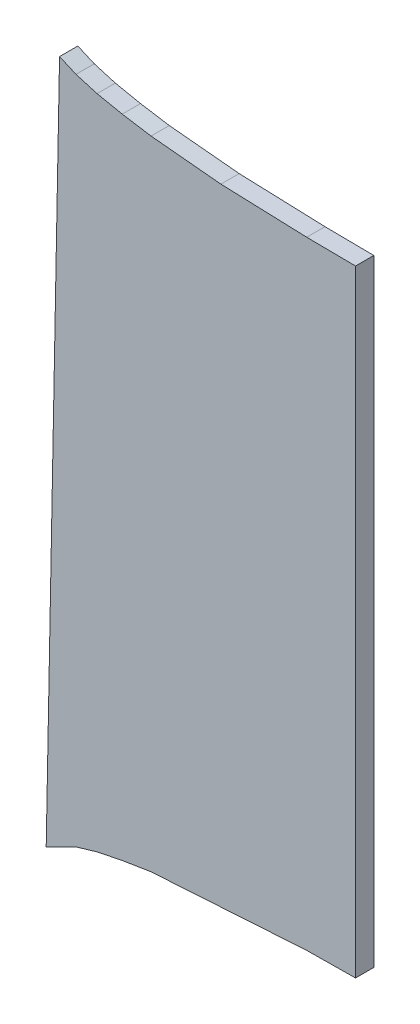
ISO-10303-21;
HEADER;
FILE_DESCRIPTION(('STEP AP214'),'2;1');
FILE_NAME('part.step','',(''),(''),'','','');
FILE_SCHEMA(('AUTOMOTIVE_DESIGN { 1 0 10303 214 1 1 1 1 }'));
ENDSEC;
DATA;
#1=APPLICATION_CONTEXT('core data for automotive mechanical design processes');
#2=APPLICATION_PROTOCOL_DEFINITION('international standard','automotive_design',2000,#1);
#3=PRODUCT_CONTEXT('',#1,'mechanical');
#4=PRODUCT('Part','Part','',(#3));
#5=PRODUCT_RELATED_PRODUCT_CATEGORY('part','',(#4));
#6=PRODUCT_DEFINITION_FORMATION('','',#4);
#7=PRODUCT_DEFINITION_CONTEXT('part definition',#1,'design');
#8=PRODUCT_DEFINITION('design','',#6,#7);
#9=PRODUCT_DEFINITION_SHAPE('','',#8);
#10=(LENGTH_UNIT() NAMED_UNIT(*) SI_UNIT(.MILLI.,.METRE.));
#11=(NAMED_UNIT(*) PLANE_ANGLE_UNIT() SI_UNIT($,.RADIAN.));
#12=(NAMED_UNIT(*) SI_UNIT($,.STERADIAN.) SOLID_ANGLE_UNIT());
#13=UNCERTAINTY_MEASURE_WITH_UNIT(LENGTH_MEASURE(1.E-05),#10,'distance_accuracy_value','');
#14=(GEOMETRIC_REPRESENTATION_CONTEXT(3) GLOBAL_UNCERTAINTY_ASSIGNED_CONTEXT((#13)) GLOBAL_UNIT_ASSIGNED_CONTEXT((#10,
#11,#12)) REPRESENTATION_CONTEXT('',''));
#15=CARTESIAN_POINT('',(0.,0.,0.));
#16=DIRECTION('',(0.,0.,1.));
#17=DIRECTION('',(1.,0.,0.));
#18=AXIS2_PLACEMENT_3D('',#15,#16,#17);
#19=CARTESIAN_POINT('',(36.9690017700195,71.5999984741211,0.));
#20=DIRECTION('',(-0.010519816185477,-0.999944665202742,0.));
#21=DIRECTION('',(-0.999944665202742,0.010519816185477,0.));
#22=AXIS2_PLACEMENT_3D('',#19,#20,#21);
#23=PLANE('',#22);
#24=DIRECTION('',(-0.999944665202742,0.010519816185477,0.));
#25=VECTOR('',#24,1.);
#26=CARTESIAN_POINT('',(36.9690017700195,71.5999984741211,0.03556));
#27=LINE('',#26,#25);
#28=CARTESIAN_POINT('',(36.9690017700195,71.5999984741211,0.03556));
#29=VERTEX_POINT('',#28);
#30=CARTESIAN_POINT('',(36.8740005493164,71.6009979248047,0.03556));
#31=VERTEX_POINT('',#30);
#32=EDGE_CURVE('E11',#29,#31,#27,.T.);
#33=ORIENTED_EDGE('',*,*,#32,.F.);
#34=DIRECTION('',(0.,0.,1.));
#35=VECTOR('',#34,1.);
#36=CARTESIAN_POINT('',(36.9690017700195,71.5999984741211,0.));
#37=LINE('',#36,#35);
#38=CARTESIAN_POINT('',(36.9690017700195,71.5999984741211,0.));
#39=VERTEX_POINT('',#38);
#40=EDGE_CURVE('E24',#39,#29,#37,.T.);
#41=ORIENTED_EDGE('',*,*,#40,.F.);
#42=DIRECTION('',(-0.999944665202742,0.010519816185477,0.));
#43=VECTOR('',#42,1.);
#44=CARTESIAN_POINT('',(36.9690017700195,71.5999984741211,0.));
#45=LINE('',#44,#43);
#46=CARTESIAN_POINT('',(36.8740005493164,71.6009979248047,0.));
#47=VERTEX_POINT('',#46);
#48=EDGE_CURVE('E142',#39,#47,#45,.T.);
#49=ORIENTED_EDGE('',*,*,#48,.T.);
#50=DIRECTION('',(0.,0.,1.));
#51=VECTOR('',#50,1.);
#52=CARTESIAN_POINT('',(36.8740005493164,71.6009979248047,0.));
#53=LINE('',#52,#51);
#54=EDGE_CURVE('E37',#47,#31,#53,.T.);
#55=ORIENTED_EDGE('',*,*,#54,.T.);
#56=EDGE_LOOP('',(#33,#41,#49,#55));
#57=FACE_BOUND('',#56,.T.);
#58=ADVANCED_FACE('F17',(#57),#23,.F.);
#59=CARTESIAN_POINT('',(36.8740005493164,71.6009979248047,0.));
#60=DIRECTION('',(-0.0359309157724351,-0.999354276166242,0.));
#61=DIRECTION('',(-0.999354276166242,0.0359309157724351,0.));
#62=AXIS2_PLACEMENT_3D('',#59,#60,#61);
#63=PLANE('',#62);
#64=DIRECTION('',(-0.999354276166242,0.0359309157724351,0.));
#65=VECTOR('',#64,1.);
#66=CARTESIAN_POINT('',(36.8740005493164,71.6009979248047,0.03556));
#67=LINE('',#66,#65);
#68=CARTESIAN_POINT('',(36.7070007324219,71.6070022583008,0.03556));
#69=VERTEX_POINT('',#68);
#70=EDGE_CURVE('E238',#31,#69,#67,.T.);
#71=ORIENTED_EDGE('',*,*,#70,.F.);
#72=ORIENTED_EDGE('',*,*,#54,.F.);
#73=DIRECTION('',(-0.999354276166242,0.0359309157724351,0.));
#74=VECTOR('',#73,1.);
#75=CARTESIAN_POINT('',(36.8740005493164,71.6009979248047,0.));
#76=LINE('',#75,#74);
#77=CARTESIAN_POINT('',(36.7070007324219,71.6070022583008,0.));
#78=VERTEX_POINT('',#77);
#79=EDGE_CURVE('E235',#47,#78,#76,.T.);
#80=ORIENTED_EDGE('',*,*,#79,.T.);
#81=DIRECTION('',(0.,0.,1.));
#82=VECTOR('',#81,1.);
#83=CARTESIAN_POINT('',(36.7070007324219,71.6070022583008,0.));
#84=LINE('',#83,#82);
#85=EDGE_CURVE('E233',#78,#69,#84,.T.);
#86=ORIENTED_EDGE('',*,*,#85,.T.);
#87=EDGE_LOOP('',(#71,#72,#80,#86));
#88=FACE_BOUND('',#87,.T.);
#89=ADVANCED_FACE('F246',(#88),#63,.F.);
#90=CARTESIAN_POINT('',(36.7070007324219,71.6070022583008,0.));
#91=DIRECTION('',(-0.0951569465430121,-0.99546228232144,0.));
#92=DIRECTION('',(-0.99546228232144,0.0951569465430121,0.));
#93=AXIS2_PLACEMENT_3D('',#90,#91,#92);
#94=PLANE('',#93);
#95=DIRECTION('',(-0.99546228232144,0.0951569465430121,0.));
#96=VECTOR('',#95,1.);
#97=CARTESIAN_POINT('',(36.7070007324219,71.6070022583008,0.03556));
#98=LINE('',#97,#96);
#99=CARTESIAN_POINT('',(36.5709991455078,71.620002746582,0.03556));
#100=VERTEX_POINT('',#99);
#101=EDGE_CURVE('E230',#69,#100,#98,.T.);
#102=ORIENTED_EDGE('',*,*,#101,.F.);
#103=ORIENTED_EDGE('',*,*,#85,.F.);
#104=DIRECTION('',(-0.99546228232144,0.0951569465430121,0.));
#105=VECTOR('',#104,1.);
#106=CARTESIAN_POINT('',(36.7070007324219,71.6070022583008,0.));
#107=LINE('',#106,#105);
#108=CARTESIAN_POINT('',(36.5709991455078,71.620002746582,0.));
#109=VERTEX_POINT('',#108);
#110=EDGE_CURVE('E227',#78,#109,#107,.T.);
#111=ORIENTED_EDGE('',*,*,#110,.T.);
#112=DIRECTION('',(0.,0.,1.));
#113=VECTOR('',#112,1.);
#114=CARTESIAN_POINT('',(36.5709991455078,71.620002746582,0.));
#115=LINE('',#114,#113);
#116=EDGE_CURVE('E225',#109,#100,#115,.T.);
#117=ORIENTED_EDGE('',*,*,#116,.T.);
#118=EDGE_LOOP('',(#102,#103,#111,#117));
#119=FACE_BOUND('',#118,.T.);
#120=ADVANCED_FACE('F252',(#119),#94,.F.);
#121=CARTESIAN_POINT('',(36.5709991455078,71.620002746582,0.));
#122=DIRECTION('',(-0.158593797855478,-0.987343915402215,0.));
#123=DIRECTION('',(-0.987343915402215,0.158593797855478,0.));
#124=AXIS2_PLACEMENT_3D('',#121,#122,#123);
#125=PLANE('',#124);
#126=DIRECTION('',(-0.987343915402215,0.158593797855478,0.));
#127=VECTOR('',#126,1.);
#128=CARTESIAN_POINT('',(36.5709991455078,71.620002746582,0.03556));
#129=LINE('',#128,#127);
#130=CARTESIAN_POINT('',(36.5149993896484,71.6289978027344,0.03556));
#131=VERTEX_POINT('',#130);
#132=EDGE_CURVE('E222',#100,#131,#129,.T.);
#133=ORIENTED_EDGE('',*,*,#132,.F.);
#134=ORIENTED_EDGE('',*,*,#116,.F.);
#135=DIRECTION('',(-0.987343915402215,0.158593797855478,0.));
#136=VECTOR('',#135,1.);
#137=CARTESIAN_POINT('',(36.5709991455078,71.620002746582,0.));
#138=LINE('',#137,#136);
#139=CARTESIAN_POINT('',(36.5149993896484,71.6289978027344,0.));
#140=VERTEX_POINT('',#139);
#141=EDGE_CURVE('E219',#109,#140,#138,.T.);
#142=ORIENTED_EDGE('',*,*,#141,.T.);
#143=DIRECTION('',(0.,0.,1.));
#144=VECTOR('',#143,1.);
#145=CARTESIAN_POINT('',(36.5149993896484,71.6289978027344,0.));
#146=LINE('',#145,#144);
#147=EDGE_CURVE('E217',#140,#131,#146,.T.);
#148=ORIENTED_EDGE('',*,*,#147,.T.);
#149=EDGE_LOOP('',(#133,#134,#142,#148));
#150=FACE_BOUND('',#149,.T.);
#151=ADVANCED_FACE('F254',(#150),#125,.F.);
#152=CARTESIAN_POINT('',(36.5149993896484,71.6289978027344,0.));
#153=DIRECTION('',(-0.200001856638997,-0.979795518126591,0.));
#154=DIRECTION('',(-0.979795518126591,0.200001856638997,0.));
#155=AXIS2_PLACEMENT_3D('',#152,#153,#154);
#156=PLANE('',#155);
#157=DIRECTION('',(-0.979795518126591,0.200001856638997,0.));
#158=VECTOR('',#157,1.);
#159=CARTESIAN_POINT('',(36.5149993896484,71.6289978027344,0.03556));
#160=LINE('',#159,#158);
#161=CARTESIAN_POINT('',(36.4659996032715,71.6389999389648,0.03556));
#162=VERTEX_POINT('',#161);
#163=EDGE_CURVE('E214',#131,#162,#160,.T.);
#164=ORIENTED_EDGE('',*,*,#163,.F.);
#165=ORIENTED_EDGE('',*,*,#147,.F.);
#166=DIRECTION('',(-0.979795518126591,0.200001856638997,0.));
#167=VECTOR('',#166,1.);
#168=CARTESIAN_POINT('',(36.5149993896484,71.6289978027344,0.));
#169=LINE('',#168,#167);
#170=CARTESIAN_POINT('',(36.4659996032715,71.6389999389648,0.));
#171=VERTEX_POINT('',#170);
#172=EDGE_CURVE('E211',#140,#171,#169,.T.);
#173=ORIENTED_EDGE('',*,*,#172,.T.);
#174=DIRECTION('',(0.,0.,1.));
#175=VECTOR('',#174,1.);
#176=CARTESIAN_POINT('',(36.4659996032715,71.6389999389648,0.));
#177=LINE('',#176,#175);
#178=EDGE_CURVE('E209',#171,#162,#177,.T.);
#179=ORIENTED_EDGE('',*,*,#178,.T.);
#180=EDGE_LOOP('',(#164,#165,#173,#179));
#181=FACE_BOUND('',#180,.T.);
#182=ADVANCED_FACE('F259',(#181),#156,.F.);
#183=CARTESIAN_POINT('',(36.4659996032715,71.6389999389648,0.));
#184=DIRECTION('',(-0.280918813771343,-0.959731535414619,0.));
#185=DIRECTION('',(-0.959731535414619,0.280918813771343,0.));
#186=AXIS2_PLACEMENT_3D('',#183,#184,#185);
#187=PLANE('',#186);
#188=DIRECTION('',(-0.959731535414619,0.280918813771343,0.));
#189=VECTOR('',#188,1.);
#190=CARTESIAN_POINT('',(36.4659996032715,71.6389999389648,0.03556));
#191=LINE('',#190,#189);
#192=CARTESIAN_POINT('',(36.4249992370605,71.6510009765625,0.03556));
#193=VERTEX_POINT('',#192);
#194=EDGE_CURVE('E206',#162,#193,#191,.T.);
#195=ORIENTED_EDGE('',*,*,#194,.F.);
#196=ORIENTED_EDGE('',*,*,#178,.F.);
#197=DIRECTION('',(-0.959731535414619,0.280918813771343,0.));
#198=VECTOR('',#197,1.);
#199=CARTESIAN_POINT('',(36.4659996032715,71.6389999389648,0.));
#200=LINE('',#199,#198);
#201=CARTESIAN_POINT('',(36.4249992370605,71.6510009765625,0.));
#202=VERTEX_POINT('',#201);
#203=EDGE_CURVE('E203',#171,#202,#200,.T.);
#204=ORIENTED_EDGE('',*,*,#203,.T.);
#205=DIRECTION('',(0.,0.,1.));
#206=VECTOR('',#205,1.);
#207=CARTESIAN_POINT('',(36.4249992370605,71.6510009765625,0.));
#208=LINE('',#207,#206);
#209=EDGE_CURVE('E201',#202,#193,#208,.T.);
#210=ORIENTED_EDGE('',*,*,#209,.T.);
#211=EDGE_LOOP('',(#195,#196,#204,#210));
#212=FACE_BOUND('',#211,.T.);
#213=ADVANCED_FACE('F262',(#212),#187,.F.);
#214=CARTESIAN_POINT('',(36.4249992370605,71.6510009765625,0.));
#215=DIRECTION('',(-0.400841752438229,-0.916147307752552,0.));
#216=DIRECTION('',(-0.916147307752552,0.400841752438229,0.));
#217=AXIS2_PLACEMENT_3D('',#214,#215,#216);
#218=PLANE('',#217);
#219=DIRECTION('',(-0.916147307752552,0.400841752438229,0.));
#220=VECTOR('',#219,1.);
#221=CARTESIAN_POINT('',(36.4249992370605,71.6510009765625,0.03556));
#222=LINE('',#221,#220);
#223=CARTESIAN_POINT('',(36.3930015563965,71.6650009155273,0.03556));
#224=VERTEX_POINT('',#223);
#225=EDGE_CURVE('E198',#193,#224,#222,.T.);
#226=ORIENTED_EDGE('',*,*,#225,.F.);
#227=ORIENTED_EDGE('',*,*,#209,.F.);
#228=DIRECTION('',(-0.916147307752552,0.400841752438229,0.));
#229=VECTOR('',#228,1.);
#230=CARTESIAN_POINT('',(36.4249992370605,71.6510009765625,0.));
#231=LINE('',#230,#229);
#232=CARTESIAN_POINT('',(36.3930015563965,71.6650009155273,0.));
#233=VERTEX_POINT('',#232);
#234=EDGE_CURVE('E195',#202,#233,#231,.T.);
#235=ORIENTED_EDGE('',*,*,#234,.T.);
#236=DIRECTION('',(0.,0.,1.));
#237=VECTOR('',#236,1.);
#238=CARTESIAN_POINT('',(36.3930015563965,71.6650009155273,0.));
#239=LINE('',#238,#237);
#240=EDGE_CURVE('E193',#233,#224,#239,.T.);
#241=ORIENTED_EDGE('',*,*,#240,.T.);
#242=EDGE_LOOP('',(#226,#227,#235,#241));
#243=FACE_BOUND('',#242,.T.);
#244=ADVANCED_FACE('F267',(#243),#218,.F.);
#245=CARTESIAN_POINT('',(36.3930015563965,71.6650009155273,0.));
#246=DIRECTION('',(0.999813197681205,-0.0193279523614092,0.));
#247=DIRECTION('',(-0.0193279523614092,-0.999813197681205,0.));
#248=AXIS2_PLACEMENT_3D('',#245,#246,#247);
#249=PLANE('',#248);
#250=DIRECTION('',(-0.0193279523614092,-0.999813197681205,0.));
#251=VECTOR('',#250,1.);
#252=CARTESIAN_POINT('',(36.3930015563965,71.6650009155273,0.03556));
#253=LINE('',#252,#251);
#254=CARTESIAN_POINT('',(36.367000579834,70.3199996948242,0.03556));
#255=VERTEX_POINT('',#254);
#256=EDGE_CURVE('E190',#224,#255,#253,.T.);
#257=ORIENTED_EDGE('',*,*,#256,.F.);
#258=ORIENTED_EDGE('',*,*,#240,.F.);
#259=DIRECTION('',(-0.0193279523614092,-0.999813197681205,0.));
#260=VECTOR('',#259,1.);
#261=CARTESIAN_POINT('',(36.3930015563965,71.6650009155273,0.));
#262=LINE('',#261,#260);
#263=CARTESIAN_POINT('',(36.367000579834,70.3199996948242,0.));
#264=VERTEX_POINT('',#263);
#265=EDGE_CURVE('E187',#233,#264,#262,.T.);
#266=ORIENTED_EDGE('',*,*,#265,.T.);
#267=DIRECTION('',(0.,0.,1.));
#268=VECTOR('',#267,1.);
#269=CARTESIAN_POINT('',(36.367000579834,70.3199996948242,0.));
#270=LINE('',#269,#268);
#271=EDGE_CURVE('E185',#264,#255,#270,.T.);
#272=ORIENTED_EDGE('',*,*,#271,.T.);
#273=EDGE_LOOP('',(#257,#258,#266,#272));
#274=FACE_BOUND('',#273,.T.);
#275=ADVANCED_FACE('F270',(#274),#249,.F.);
#276=CARTESIAN_POINT('',(36.367000579834,70.3199996948242,0.));
#277=DIRECTION('',(-0.447213595499958,0.894427190999916,0.));
#278=DIRECTION('',(0.894427190999916,0.447213595499958,0.));
#279=AXIS2_PLACEMENT_3D('',#276,#277,#278);
#280=PLANE('',#279);
#281=DIRECTION('',(0.894427190999916,0.447213595499958,0.));
#282=VECTOR('',#281,1.);
#283=CARTESIAN_POINT('',(36.367000579834,70.3199996948242,0.03556));
#284=LINE('',#283,#282);
#285=CARTESIAN_POINT('',(36.4249992370605,70.3489990234375,0.03556));
#286=VERTEX_POINT('',#285);
#287=EDGE_CURVE('E182',#255,#286,#284,.T.);
#288=ORIENTED_EDGE('',*,*,#287,.F.);
#289=ORIENTED_EDGE('',*,*,#271,.F.);
#290=DIRECTION('',(0.894427190999916,0.447213595499958,0.));
#291=VECTOR('',#290,1.);
#292=CARTESIAN_POINT('',(36.367000579834,70.3199996948242,0.));
#293=LINE('',#292,#291);
#294=CARTESIAN_POINT('',(36.4249992370605,70.3489990234375,0.));
#295=VERTEX_POINT('',#294);
#296=EDGE_CURVE('E179',#264,#295,#293,.T.);
#297=ORIENTED_EDGE('',*,*,#296,.T.);
#298=DIRECTION('',(0.,0.,1.));
#299=VECTOR('',#298,1.);
#300=CARTESIAN_POINT('',(36.4249992370605,70.3489990234375,0.));
#301=LINE('',#300,#299);
#302=EDGE_CURVE('E177',#295,#286,#301,.T.);
#303=ORIENTED_EDGE('',*,*,#302,.T.);
#304=EDGE_LOOP('',(#288,#289,#297,#303));
#305=FACE_BOUND('',#304,.T.);
#306=ADVANCED_FACE('F275',(#305),#280,.F.);
#307=CARTESIAN_POINT('',(36.4249992370605,70.3489990234375,0.));
#308=DIRECTION('',(-0.280918813771343,0.959731535414619,0.));
#309=DIRECTION('',(0.959731535414619,0.280918813771343,0.));
#310=AXIS2_PLACEMENT_3D('',#307,#308,#309);
#311=PLANE('',#310);
#312=DIRECTION('',(0.959731535414619,0.280918813771343,0.));
#313=VECTOR('',#312,1.);
#314=CARTESIAN_POINT('',(36.4249992370605,70.3489990234375,0.03556));
#315=LINE('',#314,#313);
#316=CARTESIAN_POINT('',(36.4659996032715,70.3610000610352,0.03556));
#317=VERTEX_POINT('',#316);
#318=EDGE_CURVE('E174',#286,#317,#315,.T.);
#319=ORIENTED_EDGE('',*,*,#318,.F.);
#320=ORIENTED_EDGE('',*,*,#302,.F.);
#321=DIRECTION('',(0.959731535414619,0.280918813771343,0.));
#322=VECTOR('',#321,1.);
#323=CARTESIAN_POINT('',(36.4249992370605,70.3489990234375,0.));
#324=LINE('',#323,#322);
#325=CARTESIAN_POINT('',(36.4659996032715,70.3610000610352,0.));
#326=VERTEX_POINT('',#325);
#327=EDGE_CURVE('E171',#295,#326,#324,.T.);
#328=ORIENTED_EDGE('',*,*,#327,.T.);
#329=DIRECTION('',(0.,0.,1.));
#330=VECTOR('',#329,1.);
#331=CARTESIAN_POINT('',(36.4659996032715,70.3610000610352,0.));
#332=LINE('',#331,#330);
#333=EDGE_CURVE('E169',#326,#317,#332,.T.);
#334=ORIENTED_EDGE('',*,*,#333,.T.);
#335=EDGE_LOOP('',(#319,#320,#328,#334));
#336=FACE_BOUND('',#335,.T.);
#337=ADVANCED_FACE('F278',(#336),#311,.F.);
#338=CARTESIAN_POINT('',(36.4659996032715,70.3610000610352,0.));
#339=DIRECTION('',(-0.200001856638997,0.979795518126591,0.));
#340=DIRECTION('',(0.979795518126591,0.200001856638997,0.));
#341=AXIS2_PLACEMENT_3D('',#338,#339,#340);
#342=PLANE('',#341);
#343=DIRECTION('',(0.979795518126591,0.200001856638997,0.));
#344=VECTOR('',#343,1.);
#345=CARTESIAN_POINT('',(36.4659996032715,70.3610000610352,0.03556));
#346=LINE('',#345,#344);
#347=CARTESIAN_POINT('',(36.5149993896484,70.3710021972656,0.03556));
#348=VERTEX_POINT('',#347);
#349=EDGE_CURVE('E166',#317,#348,#346,.T.);
#350=ORIENTED_EDGE('',*,*,#349,.F.);
#351=ORIENTED_EDGE('',*,*,#333,.F.);
#352=DIRECTION('',(0.979795518126591,0.200001856638997,0.));
#353=VECTOR('',#352,1.);
#354=CARTESIAN_POINT('',(36.4659996032715,70.3610000610352,0.));
#355=LINE('',#354,#353);
#356=CARTESIAN_POINT('',(36.5149993896484,70.3710021972656,0.));
#357=VERTEX_POINT('',#356);
#358=EDGE_CURVE('E163',#326,#357,#355,.T.);
#359=ORIENTED_EDGE('',*,*,#358,.T.);
#360=DIRECTION('',(0.,0.,1.));
#361=VECTOR('',#360,1.);
#362=CARTESIAN_POINT('',(36.5149993896484,70.3710021972656,0.));
#363=LINE('',#362,#361);
#364=EDGE_CURVE('E161',#357,#348,#363,.T.);
#365=ORIENTED_EDGE('',*,*,#364,.T.);
#366=EDGE_LOOP('',(#350,#351,#359,#365));
#367=FACE_BOUND('',#366,.T.);
#368=ADVANCED_FACE('F283',(#367),#342,.F.);
#369=CARTESIAN_POINT('',(36.5149993896484,70.3710021972656,0.));
#370=DIRECTION('',(-0.158593797855478,0.987343915402215,0.));
#371=DIRECTION('',(0.987343915402215,0.158593797855478,0.));
#372=AXIS2_PLACEMENT_3D('',#369,#370,#371);
#373=PLANE('',#372);
#374=DIRECTION('',(0.987343915402215,0.158593797855478,0.));
#375=VECTOR('',#374,1.);
#376=CARTESIAN_POINT('',(36.5149993896484,70.3710021972656,0.03556));
#377=LINE('',#376,#375);
#378=CARTESIAN_POINT('',(36.5709991455078,70.379997253418,0.03556));
#379=VERTEX_POINT('',#378);
#380=EDGE_CURVE('E158',#348,#379,#377,.T.);
#381=ORIENTED_EDGE('',*,*,#380,.F.);
#382=ORIENTED_EDGE('',*,*,#364,.F.);
#383=DIRECTION('',(0.987343915402215,0.158593797855478,0.));
#384=VECTOR('',#383,1.);
#385=CARTESIAN_POINT('',(36.5149993896484,70.3710021972656,0.));
#386=LINE('',#385,#384);
#387=CARTESIAN_POINT('',(36.5709991455078,70.379997253418,0.));
#388=VERTEX_POINT('',#387);
#389=EDGE_CURVE('E155',#357,#388,#386,.T.);
#390=ORIENTED_EDGE('',*,*,#389,.T.);
#391=DIRECTION('',(0.,0.,1.));
#392=VECTOR('',#391,1.);
#393=CARTESIAN_POINT('',(36.5709991455078,70.379997253418,0.));
#394=LINE('',#393,#392);
#395=EDGE_CURVE('E153',#388,#379,#394,.T.);
#396=ORIENTED_EDGE('',*,*,#395,.T.);
#397=EDGE_LOOP('',(#381,#382,#390,#396));
#398=FACE_BOUND('',#397,.T.);
#399=ADVANCED_FACE('F286',(#398),#373,.F.);
#400=CARTESIAN_POINT('',(36.5709991455078,70.379997253418,0.));
#401=DIRECTION('',(-0.0625988812322734,0.998038766816434,0.));
#402=DIRECTION('',(0.998038766816434,0.0625988812322734,0.));
#403=AXIS2_PLACEMENT_3D('',#400,#401,#402);
#404=PLANE('',#403);
#405=DIRECTION('',(0.998038766816434,0.0625988812322734,0.));
#406=VECTOR('',#405,1.);
#407=CARTESIAN_POINT('',(36.5709991455078,70.379997253418,0.03556));
#408=LINE('',#407,#406);
#409=CARTESIAN_POINT('',(36.8740005493164,70.3990020751953,0.03556));
#410=VERTEX_POINT('',#409);
#411=EDGE_CURVE('E150',#379,#410,#408,.T.);
#412=ORIENTED_EDGE('',*,*,#411,.F.);
#413=ORIENTED_EDGE('',*,*,#395,.F.);
#414=DIRECTION('',(0.998038766816434,0.0625988812322734,0.));
#415=VECTOR('',#414,1.);
#416=CARTESIAN_POINT('',(36.5709991455078,70.379997253418,0.));
#417=LINE('',#416,#415);
#418=CARTESIAN_POINT('',(36.8740005493164,70.3990020751953,0.));
#419=VERTEX_POINT('',#418);
#420=EDGE_CURVE('E148',#388,#419,#417,.T.);
#421=ORIENTED_EDGE('',*,*,#420,.T.);
#422=DIRECTION('',(0.,0.,1.));
#423=VECTOR('',#422,1.);
#424=CARTESIAN_POINT('',(36.8740005493164,70.3990020751953,0.));
#425=LINE('',#424,#423);
#426=EDGE_CURVE('E133',#419,#410,#425,.T.);
#427=ORIENTED_EDGE('',*,*,#426,.T.);
#428=EDGE_LOOP('',(#412,#413,#421,#427));
#429=FACE_BOUND('',#428,.T.);
#430=ADVANCED_FACE('F289',(#429),#404,.F.);
#431=CARTESIAN_POINT('',(36.8740005493164,70.3990020751953,0.));
#432=DIRECTION('',(-0.010519816185477,0.999944665202742,0.));
#433=DIRECTION('',(0.999944665202742,0.010519816185477,0.));
#434=AXIS2_PLACEMENT_3D('',#431,#432,#433);
#435=PLANE('',#434);
#436=DIRECTION('',(0.999944665202742,0.010519816185477,0.));
#437=VECTOR('',#436,1.);
#438=CARTESIAN_POINT('',(36.8740005493164,70.3990020751953,0.03556));
#439=LINE('',#438,#437);
#440=CARTESIAN_POINT('',(36.9690017700195,70.4000015258789,0.03556));
#441=VERTEX_POINT('',#440);
#442=EDGE_CURVE('E137',#410,#441,#439,.T.);
#443=ORIENTED_EDGE('',*,*,#442,.F.);
#444=ORIENTED_EDGE('',*,*,#426,.F.);
#445=DIRECTION('',(0.999944665202742,0.010519816185477,0.));
#446=VECTOR('',#445,1.);
#447=CARTESIAN_POINT('',(36.8740005493164,70.3990020751953,0.));
#448=LINE('',#447,#446);
#449=CARTESIAN_POINT('',(36.9690017700195,70.4000015258789,0.));
#450=VERTEX_POINT('',#449);
#451=EDGE_CURVE('E129',#419,#450,#448,.T.);
#452=ORIENTED_EDGE('',*,*,#451,.T.);
#453=DIRECTION('',(0.,0.,1.));
#454=VECTOR('',#453,1.);
#455=CARTESIAN_POINT('',(36.9690017700195,70.4000015258789,0.));
#456=LINE('',#455,#454);
#457=EDGE_CURVE('E119',#450,#441,#456,.T.);
#458=ORIENTED_EDGE('',*,*,#457,.T.);
#459=EDGE_LOOP('',(#443,#444,#452,#458));
#460=FACE_BOUND('',#459,.T.);
#461=ADVANCED_FACE('F132',(#460),#435,.F.);
#462=CARTESIAN_POINT('',(36.9690017700195,70.4000015258789,0.));
#463=DIRECTION('',(-1.,0.,0.));
#464=DIRECTION('',(0.,1.,0.));
#465=AXIS2_PLACEMENT_3D('',#462,#463,#464);
#466=PLANE('',#465);
#467=DIRECTION('',(0.,1.,0.));
#468=VECTOR('',#467,1.);
#469=CARTESIAN_POINT('',(36.9690017700195,70.4000015258789,0.03556));
#470=LINE('',#469,#468);
#471=EDGE_CURVE('E125',#441,#29,#470,.T.);
#472=ORIENTED_EDGE('',*,*,#471,.F.);
#473=ORIENTED_EDGE('',*,*,#457,.F.);
#474=DIRECTION('',(0.,1.,0.));
#475=VECTOR('',#474,1.);
#476=CARTESIAN_POINT('',(36.9690017700195,70.4000015258789,0.));
#477=LINE('',#476,#475);
#478=EDGE_CURVE('E123',#450,#39,#477,.T.);
#479=ORIENTED_EDGE('',*,*,#478,.T.);
#480=ORIENTED_EDGE('',*,*,#40,.T.);
#481=EDGE_LOOP('',(#472,#473,#479,#480));
#482=FACE_BOUND('',#481,.T.);
#483=ADVANCED_FACE('F121',(#482),#466,.F.);
#484=CARTESIAN_POINT('',(36.9690017700195,71.5999984741211,0.));
#485=DIRECTION('',(0.,0.,1.));
#486=DIRECTION('',(1.,0.,0.));
#487=AXIS2_PLACEMENT_3D('',#484,#485,#486);
#488=PLANE('',#487);
#489=ORIENTED_EDGE('',*,*,#478,.F.);
#490=ORIENTED_EDGE('',*,*,#451,.F.);
#491=ORIENTED_EDGE('',*,*,#420,.F.);
#492=ORIENTED_EDGE('',*,*,#389,.F.);
#493=ORIENTED_EDGE('',*,*,#358,.F.);
#494=ORIENTED_EDGE('',*,*,#327,.F.);
#495=ORIENTED_EDGE('',*,*,#296,.F.);
#496=ORIENTED_EDGE('',*,*,#265,.F.);
#497=ORIENTED_EDGE('',*,*,#234,.F.);
#498=ORIENTED_EDGE('',*,*,#203,.F.);
#499=ORIENTED_EDGE('',*,*,#172,.F.);
#500=ORIENTED_EDGE('',*,*,#141,.F.);
#501=ORIENTED_EDGE('',*,*,#110,.F.);
#502=ORIENTED_EDGE('',*,*,#79,.F.);
#503=ORIENTED_EDGE('',*,*,#48,.F.);
#504=EDGE_LOOP('',(#489,#490,#491,#492,#493,#494,#495,#496,#497,#498,#499,#500,#501,#502,#503));
#505=FACE_BOUND('',#504,.T.);
#506=ADVANCED_FACE('F140',(#505),#488,.F.);
#507=CARTESIAN_POINT('',(36.9690017700195,71.5999984741211,0.03556));
#508=DIRECTION('',(0.,0.,1.));
#509=DIRECTION('',(1.,0.,0.));
#510=AXIS2_PLACEMENT_3D('',#507,#508,#509);
#511=PLANE('',#510);
#512=ORIENTED_EDGE('',*,*,#32,.T.);
#513=ORIENTED_EDGE('',*,*,#70,.T.);
#514=ORIENTED_EDGE('',*,*,#101,.T.);
#515=ORIENTED_EDGE('',*,*,#132,.T.);
#516=ORIENTED_EDGE('',*,*,#163,.T.);
#517=ORIENTED_EDGE('',*,*,#194,.T.);
#518=ORIENTED_EDGE('',*,*,#225,.T.);
#519=ORIENTED_EDGE('',*,*,#256,.T.);
#520=ORIENTED_EDGE('',*,*,#287,.T.);
#521=ORIENTED_EDGE('',*,*,#318,.T.);
#522=ORIENTED_EDGE('',*,*,#349,.T.);
#523=ORIENTED_EDGE('',*,*,#380,.T.);
#524=ORIENTED_EDGE('',*,*,#411,.T.);
#525=ORIENTED_EDGE('',*,*,#442,.T.);
#526=ORIENTED_EDGE('',*,*,#471,.T.);
#527=EDGE_LOOP('',(#512,#513,#514,#515,#516,#517,#518,#519,#520,#521,#522,#523,#524,#525,#526));
#528=FACE_BOUND('',#527,.T.);
#529=ADVANCED_FACE('F249',(#528),#511,.T.);
#530=CLOSED_SHELL('',(#58,#89,#120,#151,#182,#213,#244,#275,#306,#337,#368,#399,#430,#461,#483,
#506,#529));
#531=MANIFOLD_SOLID_BREP('B1',#530);
#532=ADVANCED_BREP_SHAPE_REPRESENTATION('',(#18,#531),#14);
#533=SHAPE_DEFINITION_REPRESENTATION(#9,#532);
ENDSEC;
END-ISO-10303-21;
